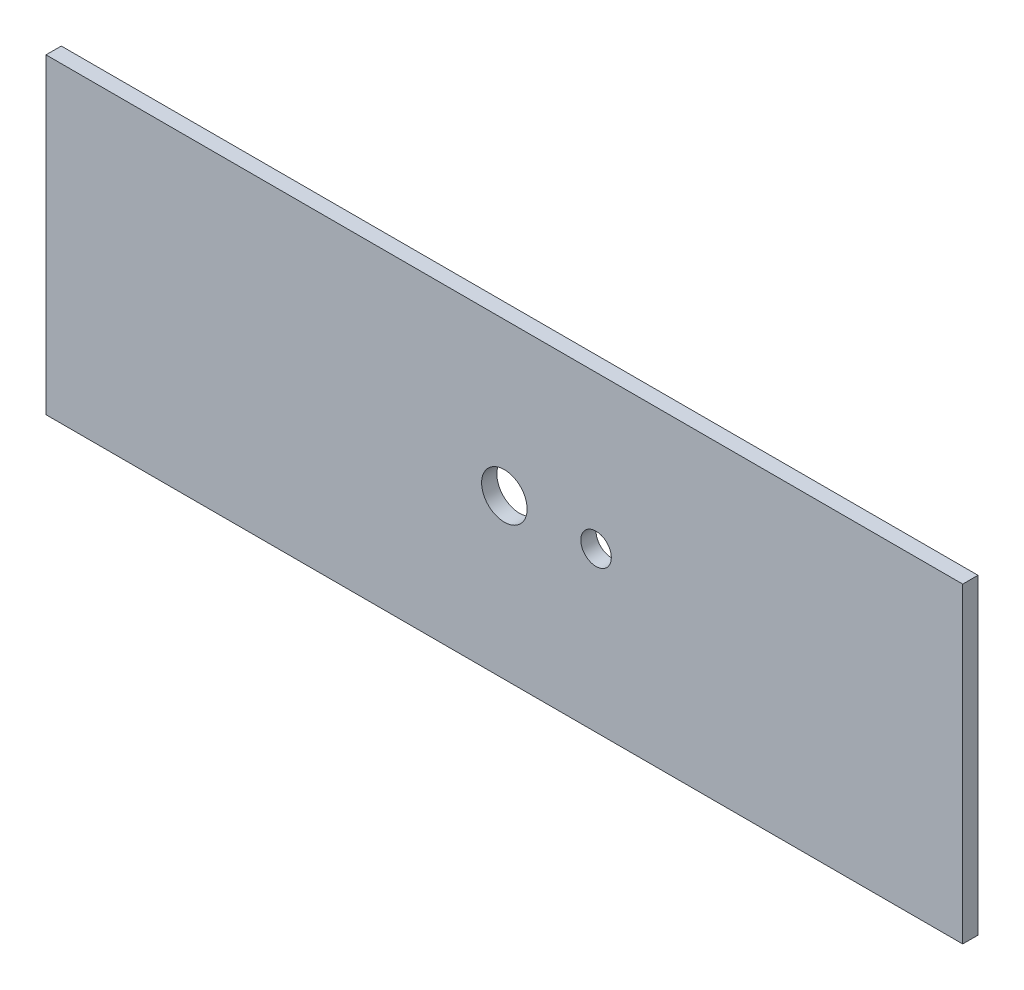
ISO-10303-21;
HEADER;
FILE_DESCRIPTION(('STEP AP214'),'2;1');
FILE_NAME('part.step','',(''),(''),'','','');
FILE_SCHEMA(('AUTOMOTIVE_DESIGN { 1 0 10303 214 1 1 1 1 }'));
ENDSEC;
DATA;
#1=APPLICATION_CONTEXT('core data for automotive mechanical design processes');
#2=APPLICATION_PROTOCOL_DEFINITION('international standard','automotive_design',2000,#1);
#3=PRODUCT_CONTEXT('',#1,'mechanical');
#4=PRODUCT('Part','Part','',(#3));
#5=PRODUCT_RELATED_PRODUCT_CATEGORY('part','',(#4));
#6=PRODUCT_DEFINITION_FORMATION('','',#4);
#7=PRODUCT_DEFINITION_CONTEXT('part definition',#1,'design');
#8=PRODUCT_DEFINITION('design','',#6,#7);
#9=PRODUCT_DEFINITION_SHAPE('','',#8);
#10=(LENGTH_UNIT() NAMED_UNIT(*) SI_UNIT(.MILLI.,.METRE.));
#11=(NAMED_UNIT(*) PLANE_ANGLE_UNIT() SI_UNIT($,.RADIAN.));
#12=(NAMED_UNIT(*) SI_UNIT($,.STERADIAN.) SOLID_ANGLE_UNIT());
#13=UNCERTAINTY_MEASURE_WITH_UNIT(LENGTH_MEASURE(1.E-05),#10,'distance_accuracy_value','');
#14=(GEOMETRIC_REPRESENTATION_CONTEXT(3) GLOBAL_UNCERTAINTY_ASSIGNED_CONTEXT((#13)) GLOBAL_UNIT_ASSIGNED_CONTEXT((#10,
#11,#12)) REPRESENTATION_CONTEXT('',''));
#15=CARTESIAN_POINT('',(0.,0.,0.));
#16=DIRECTION('',(0.,0.,1.));
#17=DIRECTION('',(1.,0.,0.));
#18=AXIS2_PLACEMENT_3D('',#15,#16,#17);
#19=CARTESIAN_POINT('',(0.,0.,0.));
#20=DIRECTION('',(0.,0.,-1.));
#21=DIRECTION('',(-1.,0.,0.));
#22=AXIS2_PLACEMENT_3D('',#19,#20,#21);
#23=PLANE('',#22);
#24=DIRECTION('',(0.,1.,0.));
#25=VECTOR('',#24,1.);
#26=CARTESIAN_POINT('',(300.,0.,0.));
#27=LINE('',#26,#25);
#28=CARTESIAN_POINT('',(300.,102.,0.));
#29=VERTEX_POINT('',#28);
#30=CARTESIAN_POINT('',(300.,0.,0.));
#31=VERTEX_POINT('',#30);
#32=EDGE_CURVE('E55',#29,#31,#27,.F.);
#33=ORIENTED_EDGE('',*,*,#32,.T.);
#34=DIRECTION('',(1.,0.,0.));
#35=VECTOR('',#34,1.);
#36=CARTESIAN_POINT('',(0.,0.,0.));
#37=LINE('',#36,#35);
#38=CARTESIAN_POINT('',(0.,0.,0.));
#39=VERTEX_POINT('',#38);
#40=EDGE_CURVE('E178',#31,#39,#37,.F.);
#41=ORIENTED_EDGE('',*,*,#40,.T.);
#42=DIRECTION('',(0.,1.,0.));
#43=VECTOR('',#42,1.);
#44=CARTESIAN_POINT('',(0.,0.,0.));
#45=LINE('',#44,#43);
#46=CARTESIAN_POINT('',(0.,102.,0.));
#47=VERTEX_POINT('',#46);
#48=EDGE_CURVE('E60',#39,#47,#45,.T.);
#49=ORIENTED_EDGE('',*,*,#48,.T.);
#50=DIRECTION('',(1.,0.,0.));
#51=VECTOR('',#50,1.);
#52=CARTESIAN_POINT('',(0.,102.,0.));
#53=LINE('',#52,#51);
#54=EDGE_CURVE('E58',#47,#29,#53,.T.);
#55=ORIENTED_EDGE('',*,*,#54,.T.);
#56=EDGE_LOOP('',(#33,#41,#49,#55));
#57=FACE_BOUND('',#56,.T.);
#58=CARTESIAN_POINT('',(150.,52.,0.));
#59=DIRECTION('',(0.,0.,1.));
#60=DIRECTION('',(1.,0.,0.));
#61=AXIS2_PLACEMENT_3D('',#58,#59,#60);
#62=CIRCLE('',#61,7.45000000000001);
#63=CARTESIAN_POINT('',(157.45,52.,0.));
#64=VERTEX_POINT('',#63);
#65=EDGE_CURVE('E66',#64,#64,#62,.T.);
#66=ORIENTED_EDGE('',*,*,#65,.T.);
#67=EDGE_LOOP('',(#66));
#68=FACE_BOUND('',#67,.T.);
#69=CARTESIAN_POINT('',(180.,52.,0.));
#70=DIRECTION('',(0.,0.,1.));
#71=DIRECTION('',(1.,0.,0.));
#72=AXIS2_PLACEMENT_3D('',#69,#70,#71);
#73=CIRCLE('',#72,4.99999999999998);
#74=CARTESIAN_POINT('',(185.,52.,0.));
#75=VERTEX_POINT('',#74);
#76=EDGE_CURVE('E20',#75,#75,#73,.T.);
#77=ORIENTED_EDGE('',*,*,#76,.T.);
#78=EDGE_LOOP('',(#77));
#79=FACE_BOUND('',#78,.T.);
#80=ADVANCED_FACE('F17',(#57,#68,#79),#23,.T.);
#81=CARTESIAN_POINT('',(180.,52.,0.));
#82=DIRECTION('',(0.,0.,1.));
#83=DIRECTION('',(1.,0.,0.));
#84=AXIS2_PLACEMENT_3D('',#81,#82,#83);
#85=CYLINDRICAL_SURFACE('',#84,4.99999999999998);
#86=ORIENTED_EDGE('',*,*,#76,.F.);
#87=EDGE_LOOP('',(#86));
#88=FACE_BOUND('',#87,.T.);
#89=CARTESIAN_POINT('',(180.,52.,5.));
#90=DIRECTION('',(0.,0.,1.));
#91=DIRECTION('',(1.,0.,0.));
#92=AXIS2_PLACEMENT_3D('',#89,#90,#91);
#93=CIRCLE('',#92,4.99999999999998);
#94=CARTESIAN_POINT('',(185.,52.,5.));
#95=VERTEX_POINT('',#94);
#96=EDGE_CURVE('E84',#95,#95,#93,.T.);
#97=ORIENTED_EDGE('',*,*,#96,.T.);
#98=EDGE_LOOP('',(#97));
#99=FACE_BOUND('',#98,.T.);
#100=ADVANCED_FACE('F92',(#88,#99),#85,.F.);
#101=CARTESIAN_POINT('',(150.,52.,0.));
#102=DIRECTION('',(0.,0.,1.));
#103=DIRECTION('',(1.,0.,0.));
#104=AXIS2_PLACEMENT_3D('',#101,#102,#103);
#105=CYLINDRICAL_SURFACE('',#104,7.45000000000001);
#106=ORIENTED_EDGE('',*,*,#65,.F.);
#107=EDGE_LOOP('',(#106));
#108=FACE_BOUND('',#107,.T.);
#109=CARTESIAN_POINT('',(150.,52.,5.));
#110=DIRECTION('',(0.,0.,1.));
#111=DIRECTION('',(1.,0.,0.));
#112=AXIS2_PLACEMENT_3D('',#109,#110,#111);
#113=CIRCLE('',#112,7.45000000000001);
#114=CARTESIAN_POINT('',(157.45,52.,5.));
#115=VERTEX_POINT('',#114);
#116=EDGE_CURVE('E81',#115,#115,#113,.T.);
#117=ORIENTED_EDGE('',*,*,#116,.T.);
#118=EDGE_LOOP('',(#117));
#119=FACE_BOUND('',#118,.T.);
#120=ADVANCED_FACE('F95',(#108,#119),#105,.F.);
#121=CARTESIAN_POINT('',(0.,102.,5.));
#122=DIRECTION('',(0.,-1.,0.));
#123=DIRECTION('',(0.,0.,-1.));
#124=AXIS2_PLACEMENT_3D('',#121,#122,#123);
#125=PLANE('',#124);
#126=DIRECTION('',(0.,0.,-1.));
#127=VECTOR('',#126,1.);
#128=CARTESIAN_POINT('',(0.,102.,5.));
#129=LINE('',#128,#127);
#130=CARTESIAN_POINT('',(0.,102.,5.));
#131=VERTEX_POINT('',#130);
#132=EDGE_CURVE('E186',#47,#131,#129,.F.);
#133=ORIENTED_EDGE('',*,*,#132,.T.);
#134=DIRECTION('',(-1.,0.,0.));
#135=VECTOR('',#134,1.);
#136=CARTESIAN_POINT('',(0.,102.,5.));
#137=LINE('',#136,#135);
#138=CARTESIAN_POINT('',(300.,102.,5.));
#139=VERTEX_POINT('',#138);
#140=EDGE_CURVE('E77',#131,#139,#137,.F.);
#141=ORIENTED_EDGE('',*,*,#140,.T.);
#142=DIRECTION('',(0.,0.,1.));
#143=VECTOR('',#142,1.);
#144=CARTESIAN_POINT('',(300.,102.,5.));
#145=LINE('',#144,#143);
#146=EDGE_CURVE('E65',#139,#29,#145,.F.);
#147=ORIENTED_EDGE('',*,*,#146,.T.);
#148=ORIENTED_EDGE('',*,*,#54,.F.);
#149=EDGE_LOOP('',(#133,#141,#147,#148));
#150=FACE_BOUND('',#149,.T.);
#151=ADVANCED_FACE('F76',(#150),#125,.F.);
#152=CARTESIAN_POINT('',(300.,0.,5.));
#153=DIRECTION('',(-1.,0.,0.));
#154=DIRECTION('',(0.,0.,1.));
#155=AXIS2_PLACEMENT_3D('',#152,#153,#154);
#156=PLANE('',#155);
#157=ORIENTED_EDGE('',*,*,#146,.F.);
#158=DIRECTION('',(0.,1.,0.));
#159=VECTOR('',#158,1.);
#160=CARTESIAN_POINT('',(300.,0.,5.));
#161=LINE('',#160,#159);
#162=CARTESIAN_POINT('',(300.,0.,5.));
#163=VERTEX_POINT('',#162);
#164=EDGE_CURVE('E179',#139,#163,#161,.F.);
#165=ORIENTED_EDGE('',*,*,#164,.T.);
#166=DIRECTION('',(0.,0.,1.));
#167=VECTOR('',#166,1.);
#168=CARTESIAN_POINT('',(300.,0.,5.));
#169=LINE('',#168,#167);
#170=EDGE_CURVE('E73',#163,#31,#169,.F.);
#171=ORIENTED_EDGE('',*,*,#170,.T.);
#172=ORIENTED_EDGE('',*,*,#32,.F.);
#173=EDGE_LOOP('',(#157,#165,#171,#172));
#174=FACE_BOUND('',#173,.T.);
#175=ADVANCED_FACE('F70',(#174),#156,.F.);
#176=CARTESIAN_POINT('',(0.,0.,5.));
#177=DIRECTION('',(0.,1.,0.));
#178=DIRECTION('',(0.,0.,1.));
#179=AXIS2_PLACEMENT_3D('',#176,#177,#178);
#180=PLANE('',#179);
#181=ORIENTED_EDGE('',*,*,#170,.F.);
#182=DIRECTION('',(-1.,0.,0.));
#183=VECTOR('',#182,1.);
#184=CARTESIAN_POINT('',(0.,0.,5.));
#185=LINE('',#184,#183);
#186=CARTESIAN_POINT('',(0.,0.,5.));
#187=VERTEX_POINT('',#186);
#188=EDGE_CURVE('E26',#163,#187,#185,.T.);
#189=ORIENTED_EDGE('',*,*,#188,.T.);
#190=DIRECTION('',(0.,0.,-1.));
#191=VECTOR('',#190,1.);
#192=CARTESIAN_POINT('',(0.,0.,5.));
#193=LINE('',#192,#191);
#194=EDGE_CURVE('E34',#187,#39,#193,.T.);
#195=ORIENTED_EDGE('',*,*,#194,.T.);
#196=ORIENTED_EDGE('',*,*,#40,.F.);
#197=EDGE_LOOP('',(#181,#189,#195,#196));
#198=FACE_BOUND('',#197,.T.);
#199=ADVANCED_FACE('F107',(#198),#180,.F.);
#200=CARTESIAN_POINT('',(0.,0.,5.));
#201=DIRECTION('',(1.,0.,0.));
#202=DIRECTION('',(0.,0.,-1.));
#203=AXIS2_PLACEMENT_3D('',#200,#201,#202);
#204=PLANE('',#203);
#205=ORIENTED_EDGE('',*,*,#194,.F.);
#206=DIRECTION('',(0.,1.,0.));
#207=VECTOR('',#206,1.);
#208=CARTESIAN_POINT('',(0.,0.,5.));
#209=LINE('',#208,#207);
#210=EDGE_CURVE('E11',#187,#131,#209,.T.);
#211=ORIENTED_EDGE('',*,*,#210,.T.);
#212=ORIENTED_EDGE('',*,*,#132,.F.);
#213=ORIENTED_EDGE('',*,*,#48,.F.);
#214=EDGE_LOOP('',(#205,#211,#212,#213));
#215=FACE_BOUND('',#214,.T.);
#216=ADVANCED_FACE('F100',(#215),#204,.F.);
#217=CARTESIAN_POINT('',(0.,0.,5.));
#218=DIRECTION('',(0.,0.,-1.));
#219=DIRECTION('',(-1.,0.,0.));
#220=AXIS2_PLACEMENT_3D('',#217,#218,#219);
#221=PLANE('',#220);
#222=ORIENTED_EDGE('',*,*,#188,.F.);
#223=ORIENTED_EDGE('',*,*,#164,.F.);
#224=ORIENTED_EDGE('',*,*,#140,.F.);
#225=ORIENTED_EDGE('',*,*,#210,.F.);
#226=EDGE_LOOP('',(#222,#223,#224,#225));
#227=FACE_BOUND('',#226,.T.);
#228=ORIENTED_EDGE('',*,*,#116,.F.);
#229=EDGE_LOOP('',(#228));
#230=FACE_BOUND('',#229,.T.);
#231=ORIENTED_EDGE('',*,*,#96,.F.);
#232=EDGE_LOOP('',(#231));
#233=FACE_BOUND('',#232,.T.);
#234=ADVANCED_FACE('F98',(#227,#230,#233),#221,.F.);
#235=CLOSED_SHELL('',(#80,#100,#120,#151,#175,#199,#216,#234));
#236=MANIFOLD_SOLID_BREP('B1',#235);
#237=ADVANCED_BREP_SHAPE_REPRESENTATION('',(#18,#236),#14);
#238=SHAPE_DEFINITION_REPRESENTATION(#9,#237);
ENDSEC;
END-ISO-10303-21;
